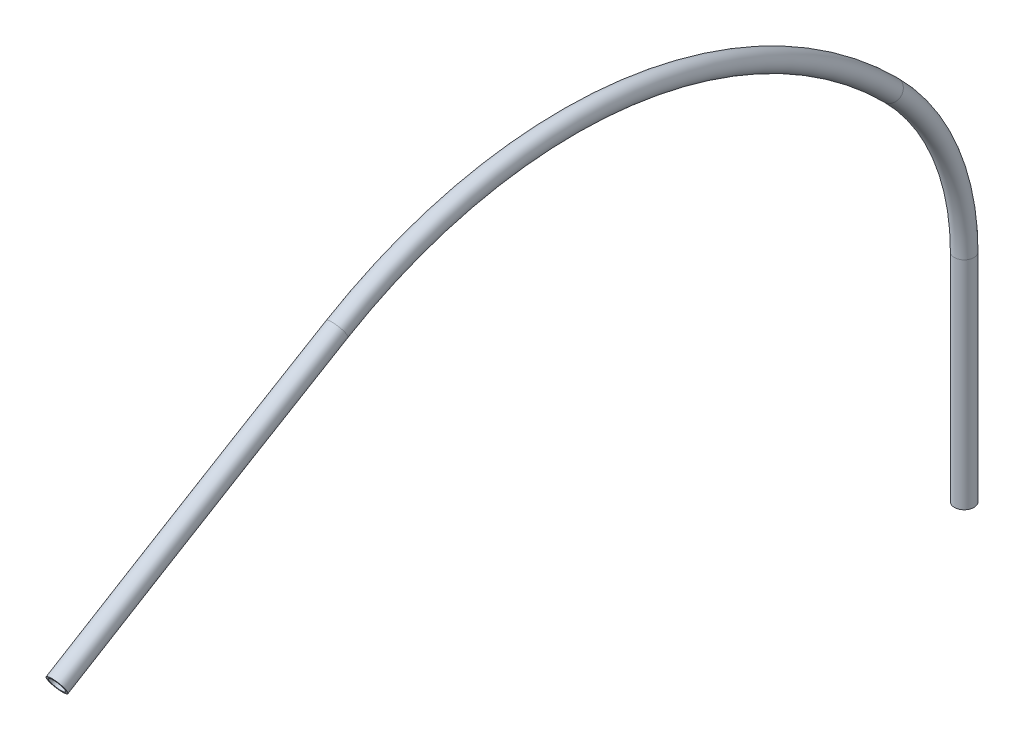
ISO-10303-21;
HEADER;
FILE_DESCRIPTION(('STEP AP214'),'2;1');
FILE_NAME('part.step','',(''),(''),'','','');
FILE_SCHEMA(('AUTOMOTIVE_DESIGN { 1 0 10303 214 1 1 1 1 }'));
ENDSEC;
DATA;
#1=APPLICATION_CONTEXT('core data for automotive mechanical design processes');
#2=APPLICATION_PROTOCOL_DEFINITION('international standard','automotive_design',2000,#1);
#3=PRODUCT_CONTEXT('',#1,'mechanical');
#4=PRODUCT('Part','Part','',(#3));
#5=PRODUCT_RELATED_PRODUCT_CATEGORY('part','',(#4));
#6=PRODUCT_DEFINITION_FORMATION('','',#4);
#7=PRODUCT_DEFINITION_CONTEXT('part definition',#1,'design');
#8=PRODUCT_DEFINITION('design','',#6,#7);
#9=PRODUCT_DEFINITION_SHAPE('','',#8);
#10=(LENGTH_UNIT() NAMED_UNIT(*) SI_UNIT(.MILLI.,.METRE.));
#11=(NAMED_UNIT(*) PLANE_ANGLE_UNIT() SI_UNIT($,.RADIAN.));
#12=(NAMED_UNIT(*) SI_UNIT($,.STERADIAN.) SOLID_ANGLE_UNIT());
#13=UNCERTAINTY_MEASURE_WITH_UNIT(LENGTH_MEASURE(1.E-05),#10,'distance_accuracy_value','');
#14=(GEOMETRIC_REPRESENTATION_CONTEXT(3) GLOBAL_UNCERTAINTY_ASSIGNED_CONTEXT((#13)) GLOBAL_UNIT_ASSIGNED_CONTEXT((#10,
#11,#12)) REPRESENTATION_CONTEXT('',''));
#15=CARTESIAN_POINT('',(0.,0.,0.));
#16=DIRECTION('',(0.,0.,1.));
#17=DIRECTION('',(1.,0.,0.));
#18=AXIS2_PLACEMENT_3D('',#15,#16,#17);
#19=CARTESIAN_POINT('',(0.,-11016.717542219,-6364.23470529255));
#20=DIRECTION('',(1.,0.,0.));
#21=DIRECTION('',(0.,0.,-1.));
#22=AXIS2_PLACEMENT_3D('',#19,#20,#21);
#23=TOROIDAL_SURFACE('',#22,13130.1715772297,5.);
#24=CARTESIAN_POINT('',(0.,277.064656452852,332.920608454681));
#25=DIRECTION('',(0.,-0.510058476719343,0.860139727211076));
#26=DIRECTION('',(0.,-0.860139727211076,-0.510058476719343));
#27=AXIS2_PLACEMENT_3D('',#24,#25,#26);
#28=CIRCLE('',#27,5.);
#29=CARTESIAN_POINT('',(0.,281.365355088907,335.470900838279));
#30=VERTEX_POINT('',#29);
#31=EDGE_CURVE('E39',#30,#30,#28,.T.);
#32=CARTESIAN_POINT('',(0.,190.846879685469,476.226198502686));
#33=DIRECTION('',(0.,-0.520972697390803,0.853573341062941));
#34=DIRECTION('',(0.,-0.853573341062941,-0.520972697390803));
#35=AXIS2_PLACEMENT_3D('',#32,#33,#34);
#36=CIRCLE('',#35,5.);
#37=CARTESIAN_POINT('',(0.,195.114746390784,478.831061989641));
#38=VERTEX_POINT('',#37);
#39=EDGE_CURVE('E10',#38,#38,#36,.T.);
#40=CARTESIAN_POINT('',(0.,-11016.717542219,-6364.23470529255));
#41=DIRECTION('',(1.,0.,0.));
#42=DIRECTION('',(0.,0.,-1.));
#43=AXIS2_PLACEMENT_3D('',#40,#41,#42);
#44=CIRCLE('',#43,13135.1715772297);
#45=EDGE_CURVE('',#30,#38,#44,.T.);
#46=ORIENTED_EDGE('',*,*,#31,.T.);
#47=ORIENTED_EDGE('',*,*,#39,.F.);
#48=ORIENTED_EDGE('',*,*,#45,.T.);
#49=ORIENTED_EDGE('',*,*,#45,.F.);
#50=EDGE_LOOP('',(#46,#48,#47,#49));
#51=FACE_BOUND('',#50,.T.);
#52=ADVANCED_FACE('F33',(#51),#23,.T.);
#53=CARTESIAN_POINT('',(0.,76.9036441057196,214.226147744877));
#54=DIRECTION('',(1.,0.,0.));
#55=DIRECTION('',(0.,0.,-1.));
#56=AXIS2_PLACEMENT_3D('',#53,#54,#55);
#57=TOROIDAL_SURFACE('',#56,232.707554383222,5.);
#58=CARTESIAN_POINT('',(0.,241.037424761722,49.2627944975957));
#59=DIRECTION('',(0.,0.708886970534837,0.70532209876477));
#60=DIRECTION('',(0.,-0.70532209876477,0.708886970534837));
#61=AXIS2_PLACEMENT_3D('',#58,#59,#60);
#62=CIRCLE('',#61,5.);
#63=CARTESIAN_POINT('',(0.,244.564035255546,45.7183596449218));
#64=VERTEX_POINT('',#63);
#65=EDGE_CURVE('E43',#64,#64,#62,.T.);
#66=CARTESIAN_POINT('',(0.,76.9036441057196,214.226147744877));
#67=DIRECTION('',(1.,0.,0.));
#68=DIRECTION('',(0.,0.,-1.));
#69=AXIS2_PLACEMENT_3D('',#66,#67,#68);
#70=CIRCLE('',#69,237.707554383222);
#71=EDGE_CURVE('',#64,#30,#70,.T.);
#72=ORIENTED_EDGE('',*,*,#65,.T.);
#73=ORIENTED_EDGE('',*,*,#31,.F.);
#74=ORIENTED_EDGE('',*,*,#71,.T.);
#75=ORIENTED_EDGE('',*,*,#71,.F.);
#76=EDGE_LOOP('',(#72,#74,#73,#75));
#77=FACE_BOUND('',#76,.T.);
#78=ADVANCED_FACE('F95',(#77),#57,.T.);
#79=CARTESIAN_POINT('',(0.,150.755404512849,140.001122334014));
#80=DIRECTION('',(1.,0.,0.));
#81=DIRECTION('',(0.,0.,-1.));
#82=AXIS2_PLACEMENT_3D('',#79,#80,#81);
#83=TOROIDAL_SURFACE('',#82,128.001122334014,5.);
#84=CARTESIAN_POINT('',(0.,150.755404512849,12.));
#85=DIRECTION('',(0.,1.,0.));
#86=DIRECTION('',(0.,0.,1.));
#87=AXIS2_PLACEMENT_3D('',#84,#85,#86);
#88=CIRCLE('',#87,5.);
#89=CARTESIAN_POINT('',(0.,150.755404512849,7.00000000000001));
#90=VERTEX_POINT('',#89);
#91=EDGE_CURVE('E47',#90,#90,#88,.T.);
#92=CARTESIAN_POINT('',(0.,150.755404512849,140.001122334014));
#93=DIRECTION('',(1.,0.,0.));
#94=DIRECTION('',(0.,0.,-1.));
#95=AXIS2_PLACEMENT_3D('',#92,#93,#94);
#96=CIRCLE('',#95,133.001122334014);
#97=EDGE_CURVE('',#90,#64,#96,.T.);
#98=ORIENTED_EDGE('',*,*,#91,.T.);
#99=ORIENTED_EDGE('',*,*,#65,.F.);
#100=ORIENTED_EDGE('',*,*,#97,.T.);
#101=ORIENTED_EDGE('',*,*,#97,.F.);
#102=EDGE_LOOP('',(#98,#100,#99,#101));
#103=FACE_BOUND('',#102,.T.);
#104=ADVANCED_FACE('F90',(#103),#83,.T.);
#105=CARTESIAN_POINT('',(0.,150.755404512849,12.));
#106=DIRECTION('',(0.,-1.,0.));
#107=DIRECTION('',(0.,0.,-1.));
#108=AXIS2_PLACEMENT_3D('',#105,#106,#107);
#109=CYLINDRICAL_SURFACE('',#108,5.);
#110=ORIENTED_EDGE('',*,*,#91,.F.);
#111=EDGE_LOOP('',(#110));
#112=FACE_BOUND('',#111,.T.);
#113=CARTESIAN_POINT('',(0.,40.,12.));
#114=DIRECTION('',(0.,1.,0.));
#115=DIRECTION('',(0.,0.,1.));
#116=AXIS2_PLACEMENT_3D('',#113,#114,#115);
#117=CIRCLE('',#116,5.);
#118=CARTESIAN_POINT('',(0.,40.,17.));
#119=VERTEX_POINT('',#118);
#120=EDGE_CURVE('E50',#119,#119,#117,.T.);
#121=ORIENTED_EDGE('',*,*,#120,.T.);
#122=EDGE_LOOP('',(#121));
#123=FACE_BOUND('',#122,.T.);
#124=ADVANCED_FACE('F82',(#112,#123),#109,.T.);
#125=CARTESIAN_POINT('',(0.,190.846879685469,476.226198502686));
#126=DIRECTION('',(0.,-0.520972697390803,0.853573341062941));
#127=DIRECTION('',(0.,-0.853573341062941,-0.520972697390803));
#128=AXIS2_PLACEMENT_3D('',#125,#126,#127);
#129=PLANE('',#128);
#130=CARTESIAN_POINT('',(0.,190.846879686591,476.226198500852));
#131=DIRECTION('',(0.,-0.520972697390803,0.853573341062941));
#132=DIRECTION('',(0.,-0.853573341062941,-0.520972697390803));
#133=AXIS2_PLACEMENT_3D('',#130,#131,#132);
#134=CIRCLE('',#133,4.);
#135=CARTESIAN_POINT('',(0.,194.26117305084,478.310089290414));
#136=VERTEX_POINT('',#135);
#137=EDGE_CURVE('E53',#136,#136,#134,.T.);
#138=ORIENTED_EDGE('',*,*,#137,.F.);
#139=EDGE_LOOP('',(#138));
#140=FACE_BOUND('',#139,.T.);
#141=ORIENTED_EDGE('',*,*,#39,.T.);
#142=EDGE_LOOP('',(#141));
#143=FACE_BOUND('',#142,.T.);
#144=ADVANCED_FACE('F80',(#140,#143),#129,.T.);
#145=CARTESIAN_POINT('',(0.,40.,12.));
#146=DIRECTION('',(0.,1.,0.));
#147=DIRECTION('',(0.,0.,1.));
#148=AXIS2_PLACEMENT_3D('',#145,#146,#147);
#149=PLANE('',#148);
#150=CARTESIAN_POINT('',(0.,40.,12.));
#151=DIRECTION('',(0.,1.,0.));
#152=DIRECTION('',(0.,0.,1.));
#153=AXIS2_PLACEMENT_3D('',#150,#151,#152);
#154=CIRCLE('',#153,4.);
#155=CARTESIAN_POINT('',(0.,40.,16.));
#156=VERTEX_POINT('',#155);
#157=EDGE_CURVE('E56',#156,#156,#154,.T.);
#158=ORIENTED_EDGE('',*,*,#157,.T.);
#159=EDGE_LOOP('',(#158));
#160=FACE_BOUND('',#159,.T.);
#161=ORIENTED_EDGE('',*,*,#120,.F.);
#162=EDGE_LOOP('',(#161));
#163=FACE_BOUND('',#162,.T.);
#164=ADVANCED_FACE('F76',(#160,#163),#149,.F.);
#165=CARTESIAN_POINT('',(0.,-11016.717542219,-6364.23470529255));
#166=DIRECTION('',(1.,0.,0.));
#167=DIRECTION('',(0.,0.,-1.));
#168=AXIS2_PLACEMENT_3D('',#165,#166,#167);
#169=TOROIDAL_SURFACE('',#168,13130.1715772297,4.);
#170=CARTESIAN_POINT('',(0.,277.064656452852,332.920608454681));
#171=DIRECTION('',(0.,0.510058476719484,-0.860139727210992));
#172=DIRECTION('',(0.,0.860139727210992,0.510058476719484));
#173=AXIS2_PLACEMENT_3D('',#170,#171,#172);
#174=CIRCLE('',#173,4.);
#175=CARTESIAN_POINT('',(0.,280.505215361694,334.960842361559));
#176=VERTEX_POINT('',#175);
#177=EDGE_CURVE('E62',#176,#176,#174,.F.);
#178=CARTESIAN_POINT('',(0.,-11016.717542219,-6364.23470529255));
#179=DIRECTION('',(1.,0.,0.));
#180=DIRECTION('',(0.,0.,-1.));
#181=AXIS2_PLACEMENT_3D('',#178,#179,#180);
#182=CIRCLE('',#181,13134.1715772297);
#183=EDGE_CURVE('',#176,#136,#182,.T.);
#184=ORIENTED_EDGE('',*,*,#177,.F.);
#185=ORIENTED_EDGE('',*,*,#137,.T.);
#186=ORIENTED_EDGE('',*,*,#183,.T.);
#187=ORIENTED_EDGE('',*,*,#183,.F.);
#188=EDGE_LOOP('',(#184,#186,#185,#187));
#189=FACE_BOUND('',#188,.T.);
#190=ADVANCED_FACE('F73',(#189),#169,.F.);
#191=CARTESIAN_POINT('',(0.,76.9036441057196,214.226147744877));
#192=DIRECTION('',(1.,0.,0.));
#193=DIRECTION('',(0.,0.,-1.));
#194=AXIS2_PLACEMENT_3D('',#191,#192,#193);
#195=TOROIDAL_SURFACE('',#194,232.707554383222,4.);
#196=CARTESIAN_POINT('',(0.,241.037424761722,49.2627944975955));
#197=DIRECTION('',(0.,-0.708886970534789,-0.705322098764819));
#198=DIRECTION('',(0.,0.705322098764819,-0.708886970534789));
#199=AXIS2_PLACEMENT_3D('',#196,#197,#198);
#200=CIRCLE('',#199,4.);
#201=CARTESIAN_POINT('',(0.,243.858713156781,46.4272466154563));
#202=VERTEX_POINT('',#201);
#203=EDGE_CURVE('E65',#202,#202,#200,.F.);
#204=CARTESIAN_POINT('',(0.,76.9036441057196,214.226147744877));
#205=DIRECTION('',(1.,0.,0.));
#206=DIRECTION('',(0.,0.,-1.));
#207=AXIS2_PLACEMENT_3D('',#204,#205,#206);
#208=CIRCLE('',#207,236.707554383222);
#209=EDGE_CURVE('',#202,#176,#208,.T.);
#210=ORIENTED_EDGE('',*,*,#203,.F.);
#211=ORIENTED_EDGE('',*,*,#177,.T.);
#212=ORIENTED_EDGE('',*,*,#209,.T.);
#213=ORIENTED_EDGE('',*,*,#209,.F.);
#214=EDGE_LOOP('',(#210,#212,#211,#213));
#215=FACE_BOUND('',#214,.T.);
#216=ADVANCED_FACE('F71',(#215),#195,.F.);
#217=CARTESIAN_POINT('',(0.,150.755404512849,140.001122334014));
#218=DIRECTION('',(1.,0.,0.));
#219=DIRECTION('',(0.,0.,-1.));
#220=AXIS2_PLACEMENT_3D('',#217,#218,#219);
#221=TOROIDAL_SURFACE('',#220,128.001122334014,4.);
#222=CARTESIAN_POINT('',(0.,150.755404512849,12.));
#223=DIRECTION('',(0.,-1.,0.));
#224=DIRECTION('',(0.,0.,-1.));
#225=AXIS2_PLACEMENT_3D('',#222,#223,#224);
#226=CIRCLE('',#225,4.);
#227=CARTESIAN_POINT('',(0.,150.755404512849,8.00000000000001));
#228=VERTEX_POINT('',#227);
#229=EDGE_CURVE('E59',#228,#228,#226,.F.);
#230=CARTESIAN_POINT('',(0.,150.755404512849,140.001122334014));
#231=DIRECTION('',(1.,0.,0.));
#232=DIRECTION('',(0.,0.,-1.));
#233=AXIS2_PLACEMENT_3D('',#230,#231,#232);
#234=CIRCLE('',#233,132.001122334014);
#235=EDGE_CURVE('',#228,#202,#234,.T.);
#236=ORIENTED_EDGE('',*,*,#229,.F.);
#237=ORIENTED_EDGE('',*,*,#203,.T.);
#238=ORIENTED_EDGE('',*,*,#235,.T.);
#239=ORIENTED_EDGE('',*,*,#235,.F.);
#240=EDGE_LOOP('',(#236,#238,#237,#239));
#241=FACE_BOUND('',#240,.T.);
#242=ADVANCED_FACE('F144',(#241),#221,.F.);
#243=CARTESIAN_POINT('',(0.,150.755404512849,12.));
#244=DIRECTION('',(0.,-1.,0.));
#245=DIRECTION('',(0.,0.,-1.));
#246=AXIS2_PLACEMENT_3D('',#243,#244,#245);
#247=CYLINDRICAL_SURFACE('',#246,4.);
#248=ORIENTED_EDGE('',*,*,#229,.T.);
#249=EDGE_LOOP('',(#248));
#250=FACE_BOUND('',#249,.T.);
#251=ORIENTED_EDGE('',*,*,#157,.F.);
#252=EDGE_LOOP('',(#251));
#253=FACE_BOUND('',#252,.T.);
#254=ADVANCED_FACE('F154',(#250,#253),#247,.F.);
#255=CLOSED_SHELL('',(#52,#78,#104,#124,#144,#164,#190,#216,#242,#254));
#256=MANIFOLD_SOLID_BREP('B2',#255);
#257=ADVANCED_BREP_SHAPE_REPRESENTATION('',(#18,#256),#14);
#258=SHAPE_DEFINITION_REPRESENTATION(#9,#257);
ENDSEC;
END-ISO-10303-21;
